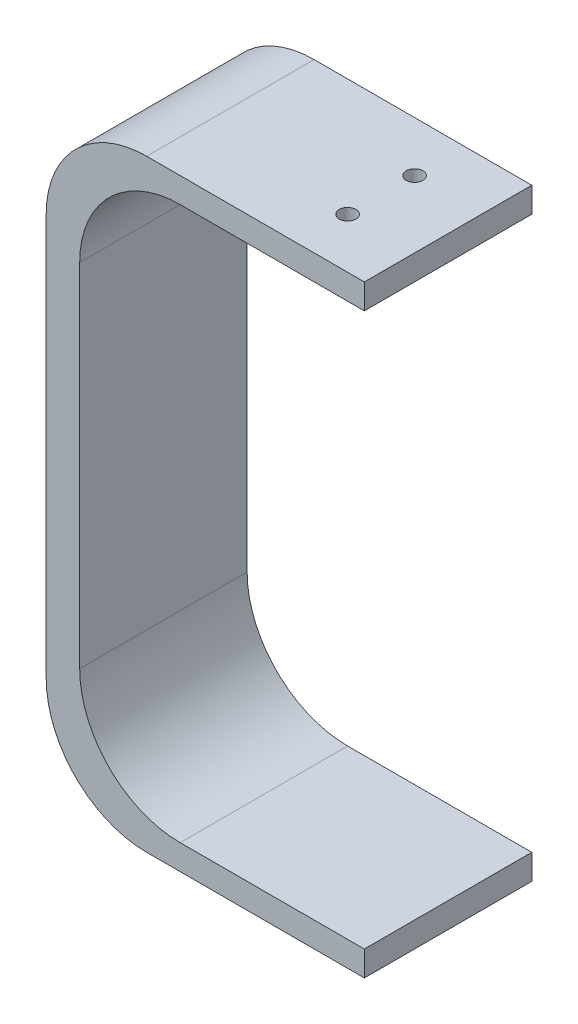
ISO-10303-21;
HEADER;
FILE_DESCRIPTION(('STEP AP214'),'2;1');
FILE_NAME('part.step','',(''),(''),'','','');
FILE_SCHEMA(('AUTOMOTIVE_DESIGN { 1 0 10303 214 1 1 1 1 }'));
ENDSEC;
DATA;
#1=APPLICATION_CONTEXT('core data for automotive mechanical design processes');
#2=APPLICATION_PROTOCOL_DEFINITION('international standard','automotive_design',2000,#1);
#3=PRODUCT_CONTEXT('',#1,'mechanical');
#4=PRODUCT('Part','Part','',(#3));
#5=PRODUCT_RELATED_PRODUCT_CATEGORY('part','',(#4));
#6=PRODUCT_DEFINITION_FORMATION('','',#4);
#7=PRODUCT_DEFINITION_CONTEXT('part definition',#1,'design');
#8=PRODUCT_DEFINITION('design','',#6,#7);
#9=PRODUCT_DEFINITION_SHAPE('','',#8);
#10=(LENGTH_UNIT() NAMED_UNIT(*) SI_UNIT(.MILLI.,.METRE.));
#11=(NAMED_UNIT(*) PLANE_ANGLE_UNIT() SI_UNIT($,.RADIAN.));
#12=(NAMED_UNIT(*) SI_UNIT($,.STERADIAN.) SOLID_ANGLE_UNIT());
#13=UNCERTAINTY_MEASURE_WITH_UNIT(LENGTH_MEASURE(1.E-05),#10,'distance_accuracy_value','');
#14=(GEOMETRIC_REPRESENTATION_CONTEXT(3) GLOBAL_UNCERTAINTY_ASSIGNED_CONTEXT((#13)) GLOBAL_UNIT_ASSIGNED_CONTEXT((#10,
#11,#12)) REPRESENTATION_CONTEXT('',''));
#15=CARTESIAN_POINT('',(0.,0.,0.));
#16=DIRECTION('',(0.,0.,1.));
#17=DIRECTION('',(1.,0.,0.));
#18=AXIS2_PLACEMENT_3D('',#15,#16,#17);
#19=CARTESIAN_POINT('',(-55.,0.,50.));
#20=DIRECTION('',(0.,1.,0.));
#21=DIRECTION('',(0.,0.,1.));
#22=AXIS2_PLACEMENT_3D('',#19,#20,#21);
#23=PLANE('',#22);
#24=CARTESIAN_POINT('',(-20.,0.,35.));
#25=DIRECTION('',(0.,-1.,0.));
#26=DIRECTION('',(0.,0.,-1.));
#27=AXIS2_PLACEMENT_3D('',#24,#25,#26);
#28=CIRCLE('',#27,2.5);
#29=CARTESIAN_POINT('',(-20.,0.,32.5));
#30=VERTEX_POINT('',#29);
#31=EDGE_CURVE('E209',#30,#30,#28,.T.);
#32=ORIENTED_EDGE('',*,*,#31,.F.);
#33=EDGE_LOOP('',(#32));
#34=FACE_BOUND('',#33,.T.);
#35=CARTESIAN_POINT('',(-20.,0.,15.));
#36=DIRECTION('',(0.,-1.,0.));
#37=DIRECTION('',(0.,0.,-1.));
#38=AXIS2_PLACEMENT_3D('',#35,#36,#37);
#39=CIRCLE('',#38,2.5);
#40=CARTESIAN_POINT('',(-20.,0.,12.5));
#41=VERTEX_POINT('',#40);
#42=EDGE_CURVE('E214',#41,#41,#39,.T.);
#43=ORIENTED_EDGE('',*,*,#42,.F.);
#44=EDGE_LOOP('',(#43));
#45=FACE_BOUND('',#44,.T.);
#46=DIRECTION('',(1.,0.,0.));
#47=VECTOR('',#46,1.);
#48=CARTESIAN_POINT('',(-55.,0.,0.));
#49=LINE('',#48,#47);
#50=CARTESIAN_POINT('',(-55.,0.,0.));
#51=VERTEX_POINT('',#50);
#52=CARTESIAN_POINT('',(0.,0.,0.));
#53=VERTEX_POINT('',#52);
#54=EDGE_CURVE('E159',#51,#53,#49,.T.);
#55=ORIENTED_EDGE('',*,*,#54,.T.);
#56=DIRECTION('',(0.,0.,-1.));
#57=VECTOR('',#56,1.);
#58=CARTESIAN_POINT('',(0.,0.,50.));
#59=LINE('',#58,#57);
#60=CARTESIAN_POINT('',(0.,0.,50.));
#61=VERTEX_POINT('',#60);
#62=EDGE_CURVE('E11',#61,#53,#59,.T.);
#63=ORIENTED_EDGE('',*,*,#62,.F.);
#64=DIRECTION('',(1.,0.,0.));
#65=VECTOR('',#64,1.);
#66=CARTESIAN_POINT('',(-55.,0.,50.));
#67=LINE('',#66,#65);
#68=CARTESIAN_POINT('',(-55.,0.,50.));
#69=VERTEX_POINT('',#68);
#70=EDGE_CURVE('E184',#69,#61,#67,.T.);
#71=ORIENTED_EDGE('',*,*,#70,.F.);
#72=DIRECTION('',(0.,0.,-1.));
#73=VECTOR('',#72,1.);
#74=CARTESIAN_POINT('',(-55.,0.,50.));
#75=LINE('',#74,#73);
#76=EDGE_CURVE('E155',#69,#51,#75,.T.);
#77=ORIENTED_EDGE('',*,*,#76,.T.);
#78=EDGE_LOOP('',(#55,#63,#71,#77));
#79=FACE_BOUND('',#78,.T.);
#80=ADVANCED_FACE('F37',(#34,#45,#79),#23,.F.);
#81=CARTESIAN_POINT('',(0.,7.5,50.));
#82=DIRECTION('',(-1.,0.,0.));
#83=DIRECTION('',(0.,-1.,0.));
#84=AXIS2_PLACEMENT_3D('',#81,#82,#83);
#85=PLANE('',#84);
#86=DIRECTION('',(0.,1.,0.));
#87=VECTOR('',#86,1.);
#88=CARTESIAN_POINT('',(0.,7.5,0.));
#89=LINE('',#88,#87);
#90=CARTESIAN_POINT('',(0.,7.5,0.));
#91=VERTEX_POINT('',#90);
#92=EDGE_CURVE('E162',#53,#91,#89,.T.);
#93=ORIENTED_EDGE('',*,*,#92,.T.);
#94=DIRECTION('',(0.,0.,-1.));
#95=VECTOR('',#94,1.);
#96=CARTESIAN_POINT('',(0.,7.5,50.));
#97=LINE('',#96,#95);
#98=CARTESIAN_POINT('',(0.,7.5,50.));
#99=VERTEX_POINT('',#98);
#100=EDGE_CURVE('E46',#99,#91,#97,.T.);
#101=ORIENTED_EDGE('',*,*,#100,.F.);
#102=DIRECTION('',(0.,1.,0.));
#103=VECTOR('',#102,1.);
#104=CARTESIAN_POINT('',(0.,7.5,50.));
#105=LINE('',#104,#103);
#106=EDGE_CURVE('E110',#61,#99,#105,.T.);
#107=ORIENTED_EDGE('',*,*,#106,.F.);
#108=ORIENTED_EDGE('',*,*,#62,.T.);
#109=EDGE_LOOP('',(#93,#101,#107,#108));
#110=FACE_BOUND('',#109,.T.);
#111=ADVANCED_FACE('F260',(#110),#85,.F.);
#112=CARTESIAN_POINT('',(-55.,7.5,50.));
#113=DIRECTION('',(0.,-1.,0.));
#114=DIRECTION('',(1.,0.,0.));
#115=AXIS2_PLACEMENT_3D('',#112,#113,#114);
#116=PLANE('',#115);
#117=CARTESIAN_POINT('',(-20.,7.5,35.));
#118=DIRECTION('',(0.,-1.,0.));
#119=DIRECTION('',(1.,0.,0.));
#120=AXIS2_PLACEMENT_3D('',#117,#118,#119);
#121=CIRCLE('',#120,2.5);
#122=CARTESIAN_POINT('',(-17.5,7.5,35.));
#123=VERTEX_POINT('',#122);
#124=EDGE_CURVE('E40',#123,#123,#121,.T.);
#125=ORIENTED_EDGE('',*,*,#124,.T.);
#126=EDGE_LOOP('',(#125));
#127=FACE_BOUND('',#126,.T.);
#128=CARTESIAN_POINT('',(-20.,7.5,15.));
#129=DIRECTION('',(0.,-1.,0.));
#130=DIRECTION('',(1.,0.,0.));
#131=AXIS2_PLACEMENT_3D('',#128,#129,#130);
#132=CIRCLE('',#131,2.5);
#133=CARTESIAN_POINT('',(-17.5,7.5,15.));
#134=VERTEX_POINT('',#133);
#135=EDGE_CURVE('E207',#134,#134,#132,.T.);
#136=ORIENTED_EDGE('',*,*,#135,.T.);
#137=EDGE_LOOP('',(#136));
#138=FACE_BOUND('',#137,.T.);
#139=DIRECTION('',(-1.,0.,0.));
#140=VECTOR('',#139,1.);
#141=CARTESIAN_POINT('',(-55.,7.5,0.));
#142=LINE('',#141,#140);
#143=CARTESIAN_POINT('',(-65.,7.5,0.));
#144=VERTEX_POINT('',#143);
#145=EDGE_CURVE('E165',#91,#144,#142,.T.);
#146=ORIENTED_EDGE('',*,*,#145,.T.);
#147=DIRECTION('',(0.,0.,-1.));
#148=VECTOR('',#147,1.);
#149=CARTESIAN_POINT('',(-65.,7.5,50.));
#150=LINE('',#149,#148);
#151=CARTESIAN_POINT('',(-65.,7.5,50.));
#152=VERTEX_POINT('',#151);
#153=EDGE_CURVE('E203',#152,#144,#150,.T.);
#154=ORIENTED_EDGE('',*,*,#153,.F.);
#155=DIRECTION('',(-1.,0.,0.));
#156=VECTOR('',#155,1.);
#157=CARTESIAN_POINT('',(-55.,7.5,50.));
#158=LINE('',#157,#156);
#159=EDGE_CURVE('E223',#99,#152,#158,.T.);
#160=ORIENTED_EDGE('',*,*,#159,.F.);
#161=ORIENTED_EDGE('',*,*,#100,.T.);
#162=EDGE_LOOP('',(#146,#154,#160,#161));
#163=FACE_BOUND('',#162,.T.);
#164=ADVANCED_FACE('F265',(#127,#138,#163),#116,.F.);
#165=CARTESIAN_POINT('',(-65.,-22.5,50.));
#166=DIRECTION('',(0.,0.,-1.));
#167=DIRECTION('',(-1.,0.,0.));
#168=AXIS2_PLACEMENT_3D('',#165,#166,#167);
#169=CYLINDRICAL_SURFACE('',#168,30.);
#170=CARTESIAN_POINT('',(-65.,-22.5,0.));
#171=DIRECTION('',(0.,0.,1.));
#172=DIRECTION('',(-1.,0.,0.));
#173=AXIS2_PLACEMENT_3D('',#170,#171,#172);
#174=CIRCLE('',#173,30.);
#175=CARTESIAN_POINT('',(-95.,-22.5,0.));
#176=VERTEX_POINT('',#175);
#177=EDGE_CURVE('E167',#144,#176,#174,.T.);
#178=ORIENTED_EDGE('',*,*,#177,.T.);
#179=DIRECTION('',(0.,0.,-1.));
#180=VECTOR('',#179,1.);
#181=CARTESIAN_POINT('',(-95.,-22.5,50.));
#182=LINE('',#181,#180);
#183=CARTESIAN_POINT('',(-95.,-22.5,50.));
#184=VERTEX_POINT('',#183);
#185=EDGE_CURVE('E200',#184,#176,#182,.T.);
#186=ORIENTED_EDGE('',*,*,#185,.F.);
#187=CARTESIAN_POINT('',(-65.,-22.5,50.));
#188=DIRECTION('',(0.,0.,1.));
#189=DIRECTION('',(-1.,0.,0.));
#190=AXIS2_PLACEMENT_3D('',#187,#188,#189);
#191=CIRCLE('',#190,30.);
#192=EDGE_CURVE('E225',#152,#184,#191,.T.);
#193=ORIENTED_EDGE('',*,*,#192,.F.);
#194=ORIENTED_EDGE('',*,*,#153,.T.);
#195=EDGE_LOOP('',(#178,#186,#193,#194));
#196=FACE_BOUND('',#195,.T.);
#197=ADVANCED_FACE('F357',(#196),#169,.T.);
#198=CARTESIAN_POINT('',(-95.,-22.5,50.));
#199=DIRECTION('',(1.,0.,0.));
#200=DIRECTION('',(0.,1.,0.));
#201=AXIS2_PLACEMENT_3D('',#198,#199,#200);
#202=PLANE('',#201);
#203=DIRECTION('',(0.,-1.,0.));
#204=VECTOR('',#203,1.);
#205=CARTESIAN_POINT('',(-95.,-22.5,0.));
#206=LINE('',#205,#204);
#207=CARTESIAN_POINT('',(-95.,-142.5,0.));
#208=VERTEX_POINT('',#207);
#209=EDGE_CURVE('E169',#176,#208,#206,.T.);
#210=ORIENTED_EDGE('',*,*,#209,.T.);
#211=DIRECTION('',(0.,0.,-1.));
#212=VECTOR('',#211,1.);
#213=CARTESIAN_POINT('',(-95.,-142.5,50.));
#214=LINE('',#213,#212);
#215=CARTESIAN_POINT('',(-95.,-142.5,50.));
#216=VERTEX_POINT('',#215);
#217=EDGE_CURVE('E197',#216,#208,#214,.T.);
#218=ORIENTED_EDGE('',*,*,#217,.F.);
#219=DIRECTION('',(0.,-1.,0.));
#220=VECTOR('',#219,1.);
#221=CARTESIAN_POINT('',(-95.,-22.5,50.));
#222=LINE('',#221,#220);
#223=EDGE_CURVE('E227',#184,#216,#222,.T.);
#224=ORIENTED_EDGE('',*,*,#223,.F.);
#225=ORIENTED_EDGE('',*,*,#185,.T.);
#226=EDGE_LOOP('',(#210,#218,#224,#225));
#227=FACE_BOUND('',#226,.T.);
#228=ADVANCED_FACE('F346',(#227),#202,.F.);
#229=CARTESIAN_POINT('',(-65.,-142.5,50.));
#230=DIRECTION('',(0.,0.,-1.));
#231=DIRECTION('',(-1.,0.,0.));
#232=AXIS2_PLACEMENT_3D('',#229,#230,#231);
#233=CYLINDRICAL_SURFACE('',#232,30.);
#234=CARTESIAN_POINT('',(-65.,-142.5,0.));
#235=DIRECTION('',(0.,0.,1.));
#236=DIRECTION('',(-1.,0.,0.));
#237=AXIS2_PLACEMENT_3D('',#234,#235,#236);
#238=CIRCLE('',#237,30.);
#239=CARTESIAN_POINT('',(-65.,-172.5,0.));
#240=VERTEX_POINT('',#239);
#241=EDGE_CURVE('E171',#208,#240,#238,.T.);
#242=ORIENTED_EDGE('',*,*,#241,.T.);
#243=DIRECTION('',(0.,0.,-1.));
#244=VECTOR('',#243,1.);
#245=CARTESIAN_POINT('',(-65.,-172.5,50.));
#246=LINE('',#245,#244);
#247=CARTESIAN_POINT('',(-65.,-172.5,50.));
#248=VERTEX_POINT('',#247);
#249=EDGE_CURVE('E194',#248,#240,#246,.T.);
#250=ORIENTED_EDGE('',*,*,#249,.F.);
#251=CARTESIAN_POINT('',(-65.,-142.5,50.));
#252=DIRECTION('',(0.,0.,1.));
#253=DIRECTION('',(-1.,0.,0.));
#254=AXIS2_PLACEMENT_3D('',#251,#252,#253);
#255=CIRCLE('',#254,30.);
#256=EDGE_CURVE('E229',#216,#248,#255,.T.);
#257=ORIENTED_EDGE('',*,*,#256,.F.);
#258=ORIENTED_EDGE('',*,*,#217,.T.);
#259=EDGE_LOOP('',(#242,#250,#257,#258));
#260=FACE_BOUND('',#259,.T.);
#261=ADVANCED_FACE('F335',(#260),#233,.T.);
#262=CARTESIAN_POINT('',(0.,-172.5,50.));
#263=DIRECTION('',(0.,1.,0.));
#264=DIRECTION('',(0.,0.,1.));
#265=AXIS2_PLACEMENT_3D('',#262,#263,#264);
#266=PLANE('',#265);
#267=DIRECTION('',(1.,0.,0.));
#268=VECTOR('',#267,1.);
#269=CARTESIAN_POINT('',(0.,-172.5,0.));
#270=LINE('',#269,#268);
#271=CARTESIAN_POINT('',(0.,-172.5,0.));
#272=VERTEX_POINT('',#271);
#273=EDGE_CURVE('E174',#240,#272,#270,.T.);
#274=ORIENTED_EDGE('',*,*,#273,.T.);
#275=DIRECTION('',(0.,0.,-1.));
#276=VECTOR('',#275,1.);
#277=CARTESIAN_POINT('',(0.,-172.5,50.));
#278=LINE('',#277,#276);
#279=CARTESIAN_POINT('',(0.,-172.5,50.));
#280=VERTEX_POINT('',#279);
#281=EDGE_CURVE('E191',#280,#272,#278,.T.);
#282=ORIENTED_EDGE('',*,*,#281,.F.);
#283=DIRECTION('',(1.,0.,0.));
#284=VECTOR('',#283,1.);
#285=CARTESIAN_POINT('',(-51.3765108004206,-172.5,50.));
#286=LINE('',#285,#284);
#287=EDGE_CURVE('E231',#248,#280,#286,.T.);
#288=ORIENTED_EDGE('',*,*,#287,.F.);
#289=ORIENTED_EDGE('',*,*,#249,.T.);
#290=EDGE_LOOP('',(#274,#282,#288,#289));
#291=FACE_BOUND('',#290,.T.);
#292=ADVANCED_FACE('F325',(#291),#266,.F.);
#293=CARTESIAN_POINT('',(0.,-165.,50.));
#294=DIRECTION('',(-1.,0.,0.));
#295=DIRECTION('',(0.,-1.,0.));
#296=AXIS2_PLACEMENT_3D('',#293,#294,#295);
#297=PLANE('',#296);
#298=DIRECTION('',(0.,1.,0.));
#299=VECTOR('',#298,1.);
#300=CARTESIAN_POINT('',(0.,-165.,0.));
#301=LINE('',#300,#299);
#302=CARTESIAN_POINT('',(0.,-165.,0.));
#303=VERTEX_POINT('',#302);
#304=EDGE_CURVE('E176',#272,#303,#301,.T.);
#305=ORIENTED_EDGE('',*,*,#304,.T.);
#306=DIRECTION('',(0.,0.,-1.));
#307=VECTOR('',#306,1.);
#308=CARTESIAN_POINT('',(0.,-165.,50.));
#309=LINE('',#308,#307);
#310=CARTESIAN_POINT('',(0.,-165.,50.));
#311=VERTEX_POINT('',#310);
#312=EDGE_CURVE('E188',#311,#303,#309,.T.);
#313=ORIENTED_EDGE('',*,*,#312,.F.);
#314=DIRECTION('',(0.,1.,0.));
#315=VECTOR('',#314,1.);
#316=CARTESIAN_POINT('',(0.,-165.,50.));
#317=LINE('',#316,#315);
#318=EDGE_CURVE('E233',#280,#311,#317,.T.);
#319=ORIENTED_EDGE('',*,*,#318,.F.);
#320=ORIENTED_EDGE('',*,*,#281,.T.);
#321=EDGE_LOOP('',(#305,#313,#319,#320));
#322=FACE_BOUND('',#321,.T.);
#323=ADVANCED_FACE('F239',(#322),#297,.F.);
#324=CARTESIAN_POINT('',(-20.,-165.,50.));
#325=DIRECTION('',(0.,-1.,0.));
#326=DIRECTION('',(1.,0.,0.));
#327=AXIS2_PLACEMENT_3D('',#324,#325,#326);
#328=PLANE('',#327);
#329=DIRECTION('',(-1.,0.,0.));
#330=VECTOR('',#329,1.);
#331=CARTESIAN_POINT('',(-20.,-165.,0.));
#332=LINE('',#331,#330);
#333=CARTESIAN_POINT('',(-55.,-165.,0.));
#334=VERTEX_POINT('',#333);
#335=EDGE_CURVE('E179',#303,#334,#332,.T.);
#336=ORIENTED_EDGE('',*,*,#335,.T.);
#337=DIRECTION('',(0.,0.,-1.));
#338=VECTOR('',#337,1.);
#339=CARTESIAN_POINT('',(-55.,-165.,50.));
#340=LINE('',#339,#338);
#341=CARTESIAN_POINT('',(-55.,-165.,50.));
#342=VERTEX_POINT('',#341);
#343=EDGE_CURVE('E150',#342,#334,#340,.T.);
#344=ORIENTED_EDGE('',*,*,#343,.F.);
#345=DIRECTION('',(-1.,0.,0.));
#346=VECTOR('',#345,1.);
#347=CARTESIAN_POINT('',(-20.,-165.,50.));
#348=LINE('',#347,#346);
#349=EDGE_CURVE('E141',#311,#342,#348,.T.);
#350=ORIENTED_EDGE('',*,*,#349,.F.);
#351=ORIENTED_EDGE('',*,*,#312,.T.);
#352=EDGE_LOOP('',(#336,#344,#350,#351));
#353=FACE_BOUND('',#352,.T.);
#354=ADVANCED_FACE('F242',(#353),#328,.F.);
#355=CARTESIAN_POINT('',(-55.,-135.,50.));
#356=DIRECTION('',(0.,0.,-1.));
#357=DIRECTION('',(-1.,0.,0.));
#358=AXIS2_PLACEMENT_3D('',#355,#356,#357);
#359=CYLINDRICAL_SURFACE('',#358,30.);
#360=CARTESIAN_POINT('',(-55.,-135.,0.));
#361=DIRECTION('',(0.,0.,-1.));
#362=DIRECTION('',(1.,0.,0.));
#363=AXIS2_PLACEMENT_3D('',#360,#361,#362);
#364=CIRCLE('',#363,30.);
#365=CARTESIAN_POINT('',(-85.,-135.,0.));
#366=VERTEX_POINT('',#365);
#367=EDGE_CURVE('E149',#334,#366,#364,.T.);
#368=ORIENTED_EDGE('',*,*,#367,.T.);
#369=DIRECTION('',(0.,0.,-1.));
#370=VECTOR('',#369,1.);
#371=CARTESIAN_POINT('',(-85.,-135.,50.));
#372=LINE('',#371,#370);
#373=CARTESIAN_POINT('',(-85.,-135.,50.));
#374=VERTEX_POINT('',#373);
#375=EDGE_CURVE('E146',#374,#366,#372,.T.);
#376=ORIENTED_EDGE('',*,*,#375,.F.);
#377=CARTESIAN_POINT('',(-55.,-135.,50.));
#378=DIRECTION('',(0.,0.,-1.));
#379=DIRECTION('',(1.,0.,0.));
#380=AXIS2_PLACEMENT_3D('',#377,#378,#379);
#381=CIRCLE('',#380,30.);
#382=EDGE_CURVE('E135',#342,#374,#381,.T.);
#383=ORIENTED_EDGE('',*,*,#382,.F.);
#384=ORIENTED_EDGE('',*,*,#343,.T.);
#385=EDGE_LOOP('',(#368,#376,#383,#384));
#386=FACE_BOUND('',#385,.T.);
#387=ADVANCED_FACE('F147',(#386),#359,.F.);
#388=CARTESIAN_POINT('',(-85.,-30.,50.));
#389=DIRECTION('',(-1.,0.,0.));
#390=DIRECTION('',(0.,-1.,0.));
#391=AXIS2_PLACEMENT_3D('',#388,#389,#390);
#392=PLANE('',#391);
#393=DIRECTION('',(0.,1.,0.));
#394=VECTOR('',#393,1.);
#395=CARTESIAN_POINT('',(-85.,-30.,0.));
#396=LINE('',#395,#394);
#397=CARTESIAN_POINT('',(-85.,-30.,0.));
#398=VERTEX_POINT('',#397);
#399=EDGE_CURVE('E96',#366,#398,#396,.T.);
#400=ORIENTED_EDGE('',*,*,#399,.T.);
#401=DIRECTION('',(0.,0.,-1.));
#402=VECTOR('',#401,1.);
#403=CARTESIAN_POINT('',(-85.,-30.,50.));
#404=LINE('',#403,#402);
#405=CARTESIAN_POINT('',(-85.,-30.,50.));
#406=VERTEX_POINT('',#405);
#407=EDGE_CURVE('E151',#406,#398,#404,.T.);
#408=ORIENTED_EDGE('',*,*,#407,.F.);
#409=DIRECTION('',(0.,1.,0.));
#410=VECTOR('',#409,1.);
#411=CARTESIAN_POINT('',(-85.,-30.,50.));
#412=LINE('',#411,#410);
#413=EDGE_CURVE('E139',#374,#406,#412,.T.);
#414=ORIENTED_EDGE('',*,*,#413,.F.);
#415=ORIENTED_EDGE('',*,*,#375,.T.);
#416=EDGE_LOOP('',(#400,#408,#414,#415));
#417=FACE_BOUND('',#416,.T.);
#418=ADVANCED_FACE('F153',(#417),#392,.F.);
#419=CARTESIAN_POINT('',(-55.,-30.,50.));
#420=DIRECTION('',(0.,0.,-1.));
#421=DIRECTION('',(-1.,0.,0.));
#422=AXIS2_PLACEMENT_3D('',#419,#420,#421);
#423=CYLINDRICAL_SURFACE('',#422,30.);
#424=CARTESIAN_POINT('',(-55.,-30.,0.));
#425=DIRECTION('',(0.,0.,-1.));
#426=DIRECTION('',(1.,0.,0.));
#427=AXIS2_PLACEMENT_3D('',#424,#425,#426);
#428=CIRCLE('',#427,30.);
#429=EDGE_CURVE('E102',#398,#51,#428,.T.);
#430=ORIENTED_EDGE('',*,*,#429,.T.);
#431=ORIENTED_EDGE('',*,*,#76,.F.);
#432=CARTESIAN_POINT('',(-55.,-30.,50.));
#433=DIRECTION('',(0.,0.,-1.));
#434=DIRECTION('',(1.,0.,0.));
#435=AXIS2_PLACEMENT_3D('',#432,#433,#434);
#436=CIRCLE('',#435,30.);
#437=EDGE_CURVE('E55',#406,#69,#436,.T.);
#438=ORIENTED_EDGE('',*,*,#437,.F.);
#439=ORIENTED_EDGE('',*,*,#407,.T.);
#440=EDGE_LOOP('',(#430,#431,#438,#439));
#441=FACE_BOUND('',#440,.T.);
#442=ADVANCED_FACE('F249',(#441),#423,.F.);
#443=CARTESIAN_POINT('',(-65.,-22.5,50.));
#444=DIRECTION('',(0.,0.,-1.));
#445=DIRECTION('',(-1.,0.,0.));
#446=AXIS2_PLACEMENT_3D('',#443,#444,#445);
#447=PLANE('',#446);
#448=ORIENTED_EDGE('',*,*,#70,.T.);
#449=ORIENTED_EDGE('',*,*,#106,.T.);
#450=ORIENTED_EDGE('',*,*,#159,.T.);
#451=ORIENTED_EDGE('',*,*,#192,.T.);
#452=ORIENTED_EDGE('',*,*,#223,.T.);
#453=ORIENTED_EDGE('',*,*,#256,.T.);
#454=ORIENTED_EDGE('',*,*,#287,.T.);
#455=ORIENTED_EDGE('',*,*,#318,.T.);
#456=ORIENTED_EDGE('',*,*,#349,.T.);
#457=ORIENTED_EDGE('',*,*,#382,.T.);
#458=ORIENTED_EDGE('',*,*,#413,.T.);
#459=ORIENTED_EDGE('',*,*,#437,.T.);
#460=EDGE_LOOP('',(#448,#449,#450,#451,#452,#453,#454,#455,#456,#457,#458,#459));
#461=FACE_BOUND('',#460,.T.);
#462=ADVANCED_FACE('F137',(#461),#447,.F.);
#463=CARTESIAN_POINT('',(-65.,-22.5,0.));
#464=DIRECTION('',(0.,0.,-1.));
#465=DIRECTION('',(-1.,0.,0.));
#466=AXIS2_PLACEMENT_3D('',#463,#464,#465);
#467=PLANE('',#466);
#468=ORIENTED_EDGE('',*,*,#54,.F.);
#469=ORIENTED_EDGE('',*,*,#429,.F.);
#470=ORIENTED_EDGE('',*,*,#399,.F.);
#471=ORIENTED_EDGE('',*,*,#367,.F.);
#472=ORIENTED_EDGE('',*,*,#335,.F.);
#473=ORIENTED_EDGE('',*,*,#304,.F.);
#474=ORIENTED_EDGE('',*,*,#273,.F.);
#475=ORIENTED_EDGE('',*,*,#241,.F.);
#476=ORIENTED_EDGE('',*,*,#209,.F.);
#477=ORIENTED_EDGE('',*,*,#177,.F.);
#478=ORIENTED_EDGE('',*,*,#145,.F.);
#479=ORIENTED_EDGE('',*,*,#92,.F.);
#480=EDGE_LOOP('',(#468,#469,#470,#471,#472,#473,#474,#475,#476,#477,#478,#479));
#481=FACE_BOUND('',#480,.T.);
#482=ADVANCED_FACE('F245',(#481),#467,.T.);
#483=CARTESIAN_POINT('',(-20.,24.,15.));
#484=DIRECTION('',(0.,-1.,0.));
#485=DIRECTION('',(0.,0.,-1.));
#486=AXIS2_PLACEMENT_3D('',#483,#484,#485);
#487=CYLINDRICAL_SURFACE('',#486,2.5);
#488=ORIENTED_EDGE('',*,*,#42,.T.);
#489=EDGE_LOOP('',(#488));
#490=FACE_BOUND('',#489,.T.);
#491=ORIENTED_EDGE('',*,*,#135,.F.);
#492=EDGE_LOOP('',(#491));
#493=FACE_BOUND('',#492,.T.);
#494=ADVANCED_FACE('F269',(#490,#493),#487,.F.);
#495=CARTESIAN_POINT('',(-20.,24.,35.));
#496=DIRECTION('',(0.,-1.,0.));
#497=DIRECTION('',(0.,0.,-1.));
#498=AXIS2_PLACEMENT_3D('',#495,#496,#497);
#499=CYLINDRICAL_SURFACE('',#498,2.5);
#500=ORIENTED_EDGE('',*,*,#31,.T.);
#501=EDGE_LOOP('',(#500));
#502=FACE_BOUND('',#501,.T.);
#503=ORIENTED_EDGE('',*,*,#124,.F.);
#504=EDGE_LOOP('',(#503));
#505=FACE_BOUND('',#504,.T.);
#506=ADVANCED_FACE('F272',(#502,#505),#499,.F.);
#507=CLOSED_SHELL('',(#80,#111,#164,#197,#228,#261,#292,#323,#354,#387,#418,#442,#462,#482,#494,#506));
#508=MANIFOLD_SOLID_BREP('B2',#507);
#509=ADVANCED_BREP_SHAPE_REPRESENTATION('',(#18,#508),#14);
#510=SHAPE_DEFINITION_REPRESENTATION(#9,#509);
ENDSEC;
END-ISO-10303-21;
